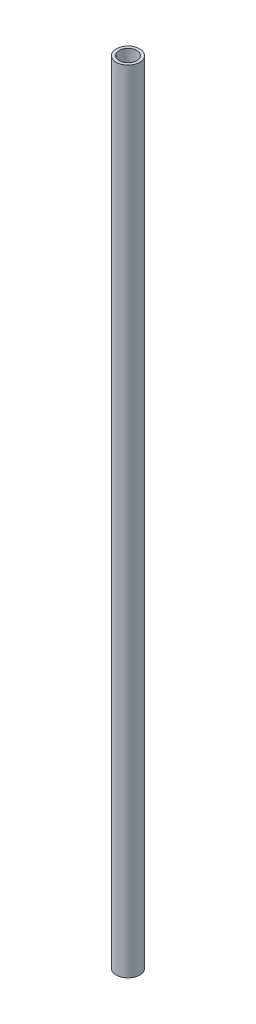
ISO-10303-21;
HEADER;
FILE_DESCRIPTION(('STEP AP214'),'2;1');
FILE_NAME('part.step','',(''),(''),'','','');
FILE_SCHEMA(('AUTOMOTIVE_DESIGN { 1 0 10303 214 1 1 1 1 }'));
ENDSEC;
DATA;
#1=APPLICATION_CONTEXT('core data for automotive mechanical design processes');
#2=APPLICATION_PROTOCOL_DEFINITION('international standard','automotive_design',2000,#1);
#3=PRODUCT_CONTEXT('',#1,'mechanical');
#4=PRODUCT('Part','Part','',(#3));
#5=PRODUCT_RELATED_PRODUCT_CATEGORY('part','',(#4));
#6=PRODUCT_DEFINITION_FORMATION('','',#4);
#7=PRODUCT_DEFINITION_CONTEXT('part definition',#1,'design');
#8=PRODUCT_DEFINITION('design','',#6,#7);
#9=PRODUCT_DEFINITION_SHAPE('','',#8);
#10=(LENGTH_UNIT() NAMED_UNIT(*) SI_UNIT(.MILLI.,.METRE.));
#11=(NAMED_UNIT(*) PLANE_ANGLE_UNIT() SI_UNIT($,.RADIAN.));
#12=(NAMED_UNIT(*) SI_UNIT($,.STERADIAN.) SOLID_ANGLE_UNIT());
#13=UNCERTAINTY_MEASURE_WITH_UNIT(LENGTH_MEASURE(1.E-05),#10,'distance_accuracy_value','');
#14=(GEOMETRIC_REPRESENTATION_CONTEXT(3) GLOBAL_UNCERTAINTY_ASSIGNED_CONTEXT((#13)) GLOBAL_UNIT_ASSIGNED_CONTEXT((#10,
#11,#12)) REPRESENTATION_CONTEXT('',''));
#15=CARTESIAN_POINT('',(0.,0.,0.));
#16=DIRECTION('',(0.,0.,1.));
#17=DIRECTION('',(1.,0.,0.));
#18=AXIS2_PLACEMENT_3D('',#15,#16,#17);
#19=CARTESIAN_POINT('',(0.,0.,0.));
#20=DIRECTION('',(0.,1.,0.));
#21=DIRECTION('',(0.,0.,1.));
#22=AXIS2_PLACEMENT_3D('',#19,#20,#21);
#23=CYLINDRICAL_SURFACE('',#22,4.);
#24=CARTESIAN_POINT('',(0.,270.,0.));
#25=DIRECTION('',(0.,1.,0.));
#26=DIRECTION('',(0.,0.,1.));
#27=AXIS2_PLACEMENT_3D('',#24,#25,#26);
#28=CIRCLE('',#27,4.);
#29=CARTESIAN_POINT('',(0.,270.,4.));
#30=VERTEX_POINT('',#29);
#31=EDGE_CURVE('E50',#30,#30,#28,.T.);
#32=ORIENTED_EDGE('',*,*,#31,.F.);
#33=EDGE_LOOP('',(#32));
#34=FACE_BOUND('',#33,.T.);
#35=CARTESIAN_POINT('',(0.,0.,0.));
#36=DIRECTION('',(0.,1.,0.));
#37=DIRECTION('',(0.,0.,1.));
#38=AXIS2_PLACEMENT_3D('',#35,#36,#37);
#39=CIRCLE('',#38,4.);
#40=CARTESIAN_POINT('',(0.,0.,4.));
#41=VERTEX_POINT('',#40);
#42=EDGE_CURVE('E35',#41,#41,#39,.T.);
#43=ORIENTED_EDGE('',*,*,#42,.T.);
#44=EDGE_LOOP('',(#43));
#45=FACE_BOUND('',#44,.T.);
#46=ADVANCED_FACE('F32',(#34,#45),#23,.T.);
#47=CARTESIAN_POINT('',(0.,0.,0.));
#48=DIRECTION('',(0.,1.,0.));
#49=DIRECTION('',(0.,0.,1.));
#50=AXIS2_PLACEMENT_3D('',#47,#48,#49);
#51=PLANE('',#50);
#52=CARTESIAN_POINT('',(0.,0.,0.));
#53=DIRECTION('',(0.,1.,0.));
#54=DIRECTION('',(0.,0.,1.));
#55=AXIS2_PLACEMENT_3D('',#52,#53,#54);
#56=CIRCLE('',#55,3.);
#57=CARTESIAN_POINT('',(0.,0.,3.));
#58=VERTEX_POINT('',#57);
#59=EDGE_CURVE('E40',#58,#58,#56,.F.);
#60=ORIENTED_EDGE('',*,*,#59,.F.);
#61=EDGE_LOOP('',(#60));
#62=FACE_BOUND('',#61,.T.);
#63=ORIENTED_EDGE('',*,*,#42,.F.);
#64=EDGE_LOOP('',(#63));
#65=FACE_BOUND('',#64,.T.);
#66=ADVANCED_FACE('F68',(#62,#65),#51,.F.);
#67=CARTESIAN_POINT('',(0.,270.,0.));
#68=DIRECTION('',(0.,1.,0.));
#69=DIRECTION('',(0.,0.,1.));
#70=AXIS2_PLACEMENT_3D('',#67,#68,#69);
#71=PLANE('',#70);
#72=CARTESIAN_POINT('',(0.,270.,0.));
#73=DIRECTION('',(0.,1.,0.));
#74=DIRECTION('',(0.,0.,1.));
#75=AXIS2_PLACEMENT_3D('',#72,#73,#74);
#76=CIRCLE('',#75,3.);
#77=CARTESIAN_POINT('',(0.,270.,3.));
#78=VERTEX_POINT('',#77);
#79=EDGE_CURVE('E11',#78,#78,#76,.F.);
#80=ORIENTED_EDGE('',*,*,#79,.T.);
#81=EDGE_LOOP('',(#80));
#82=FACE_BOUND('',#81,.T.);
#83=ORIENTED_EDGE('',*,*,#31,.T.);
#84=EDGE_LOOP('',(#83));
#85=FACE_BOUND('',#84,.T.);
#86=ADVANCED_FACE('F57',(#82,#85),#71,.T.);
#87=CARTESIAN_POINT('',(0.,0.,0.));
#88=DIRECTION('',(0.,1.,0.));
#89=DIRECTION('',(0.,0.,1.));
#90=AXIS2_PLACEMENT_3D('',#87,#88,#89);
#91=CYLINDRICAL_SURFACE('',#90,3.);
#92=ORIENTED_EDGE('',*,*,#79,.F.);
#93=EDGE_LOOP('',(#92));
#94=FACE_BOUND('',#93,.T.);
#95=ORIENTED_EDGE('',*,*,#59,.T.);
#96=EDGE_LOOP('',(#95));
#97=FACE_BOUND('',#96,.T.);
#98=ADVANCED_FACE('F60',(#94,#97),#91,.F.);
#99=CLOSED_SHELL('',(#46,#66,#86,#98));
#100=MANIFOLD_SOLID_BREP('B2',#99);
#101=ADVANCED_BREP_SHAPE_REPRESENTATION('',(#18,#100),#14);
#102=SHAPE_DEFINITION_REPRESENTATION(#9,#101);
ENDSEC;
END-ISO-10303-21;
